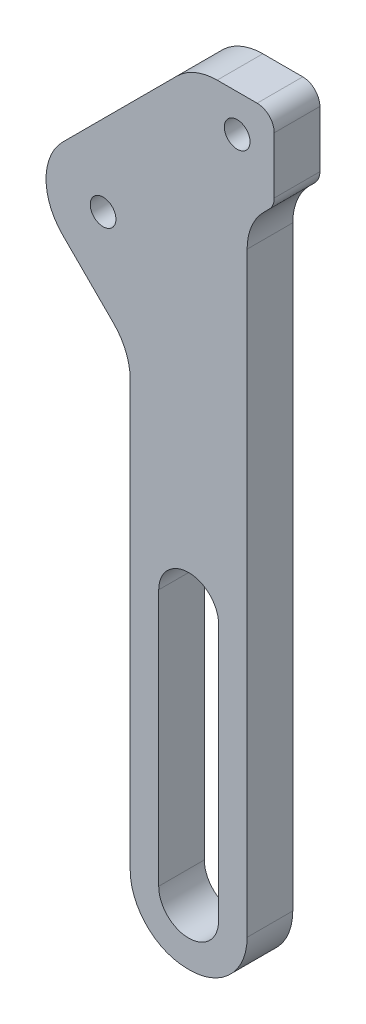
ISO-10303-21;
HEADER;
FILE_DESCRIPTION(('STEP AP214'),'2;1');
FILE_NAME('part.step','',(''),(''),'','','');
FILE_SCHEMA(('AUTOMOTIVE_DESIGN { 1 0 10303 214 1 1 1 1 }'));
ENDSEC;
DATA;
#1=APPLICATION_CONTEXT('core data for automotive mechanical design processes');
#2=APPLICATION_PROTOCOL_DEFINITION('international standard','automotive_design',2000,#1);
#3=PRODUCT_CONTEXT('',#1,'mechanical');
#4=PRODUCT('Part','Part','',(#3));
#5=PRODUCT_RELATED_PRODUCT_CATEGORY('part','',(#4));
#6=PRODUCT_DEFINITION_FORMATION('','',#4);
#7=PRODUCT_DEFINITION_CONTEXT('part definition',#1,'design');
#8=PRODUCT_DEFINITION('design','',#6,#7);
#9=PRODUCT_DEFINITION_SHAPE('','',#8);
#10=(LENGTH_UNIT() NAMED_UNIT(*) SI_UNIT(.MILLI.,.METRE.));
#11=(NAMED_UNIT(*) PLANE_ANGLE_UNIT() SI_UNIT($,.RADIAN.));
#12=(NAMED_UNIT(*) SI_UNIT($,.STERADIAN.) SOLID_ANGLE_UNIT());
#13=UNCERTAINTY_MEASURE_WITH_UNIT(LENGTH_MEASURE(1.E-05),#10,'distance_accuracy_value','');
#14=(GEOMETRIC_REPRESENTATION_CONTEXT(3) GLOBAL_UNCERTAINTY_ASSIGNED_CONTEXT((#13)) GLOBAL_UNIT_ASSIGNED_CONTEXT((#10,
#11,#12)) REPRESENTATION_CONTEXT('',''));
#15=CARTESIAN_POINT('',(0.,0.,0.));
#16=DIRECTION('',(0.,0.,1.));
#17=DIRECTION('',(1.,0.,0.));
#18=AXIS2_PLACEMENT_3D('',#15,#16,#17);
#19=CARTESIAN_POINT('',(0.,0.,0.));
#20=DIRECTION('',(0.,0.,1.));
#21=DIRECTION('',(1.,0.,0.));
#22=AXIS2_PLACEMENT_3D('',#19,#20,#21);
#23=PLANE('',#22);
#24=CARTESIAN_POINT('',(15.,-52.5,0.));
#25=DIRECTION('',(0.,0.,1.));
#26=DIRECTION('',(1.,0.,0.));
#27=AXIS2_PLACEMENT_3D('',#24,#25,#26);
#28=CIRCLE('',#27,5.25000000000001);
#29=CARTESIAN_POINT('',(20.25,-52.5,0.));
#30=VERTEX_POINT('',#29);
#31=CARTESIAN_POINT('',(9.75,-52.5,0.));
#32=VERTEX_POINT('',#31);
#33=EDGE_CURVE('E251',#30,#32,#28,.T.);
#34=ORIENTED_EDGE('',*,*,#33,.F.);
#35=DIRECTION('',(0.,1.,0.));
#36=VECTOR('',#35,1.);
#37=CARTESIAN_POINT('',(20.25,-52.5,0.));
#38=LINE('',#37,#36);
#39=CARTESIAN_POINT('',(20.25,-97.5,0.));
#40=VERTEX_POINT('',#39);
#41=EDGE_CURVE('E256',#40,#30,#38,.T.);
#42=ORIENTED_EDGE('',*,*,#41,.F.);
#43=CARTESIAN_POINT('',(15.,-97.5,0.));
#44=DIRECTION('',(0.,0.,1.));
#45=DIRECTION('',(1.,0.,0.));
#46=AXIS2_PLACEMENT_3D('',#43,#44,#45);
#47=CIRCLE('',#46,5.25000000000001);
#48=CARTESIAN_POINT('',(9.75000000000001,-97.5,0.));
#49=VERTEX_POINT('',#48);
#50=EDGE_CURVE('E270',#49,#40,#47,.T.);
#51=ORIENTED_EDGE('',*,*,#50,.F.);
#52=DIRECTION('',(0.,-1.,0.));
#53=VECTOR('',#52,1.);
#54=CARTESIAN_POINT('',(9.75,-52.5,0.));
#55=LINE('',#54,#53);
#56=EDGE_CURVE('E267',#32,#49,#55,.T.);
#57=ORIENTED_EDGE('',*,*,#56,.F.);
#58=EDGE_LOOP('',(#34,#42,#51,#57));
#59=FACE_BOUND('',#58,.T.);
#60=CARTESIAN_POINT('',(23.51,23.51,0.));
#61=DIRECTION('',(0.,0.,-1.));
#62=DIRECTION('',(-1.,0.,0.));
#63=AXIS2_PLACEMENT_3D('',#60,#61,#62);
#64=CIRCLE('',#63,2.25);
#65=CARTESIAN_POINT('',(21.26,23.51,0.));
#66=VERTEX_POINT('',#65);
#67=EDGE_CURVE('E248',#66,#66,#64,.T.);
#68=ORIENTED_EDGE('',*,*,#67,.T.);
#69=EDGE_LOOP('',(#68));
#70=FACE_BOUND('',#69,.T.);
#71=CARTESIAN_POINT('',(0.,0.,0.));
#72=DIRECTION('',(0.,0.,-1.));
#73=DIRECTION('',(-1.,0.,0.));
#74=AXIS2_PLACEMENT_3D('',#71,#72,#73);
#75=CIRCLE('',#74,2.25);
#76=CARTESIAN_POINT('',(-2.25,0.,0.));
#77=VERTEX_POINT('',#76);
#78=EDGE_CURVE('E236',#77,#77,#75,.T.);
#79=ORIENTED_EDGE('',*,*,#78,.T.);
#80=EDGE_LOOP('',(#79));
#81=FACE_BOUND('',#80,.T.);
#82=DIRECTION('',(0.707106781186549,0.707106781186546,0.));
#83=VECTOR('',#82,1.);
#84=CARTESIAN_POINT('',(7.07106781186542,-7.07106781186545,0.));
#85=LINE('',#84,#83);
#86=CARTESIAN_POINT('',(28.1789321881346,14.0367965644036,0.));
#87=VERTEX_POINT('',#86);
#88=CARTESIAN_POINT('',(29.1213203435596,14.9791847198287,0.));
#89=VERTEX_POINT('',#88);
#90=EDGE_CURVE('E211',#87,#89,#85,.T.);
#91=ORIENTED_EDGE('',*,*,#90,.T.);
#92=CARTESIAN_POINT('',(27.,17.1005050633883,0.));
#93=DIRECTION('',(0.,0.,1.));
#94=DIRECTION('',(1.,0.,0.));
#95=AXIS2_PLACEMENT_3D('',#92,#93,#94);
#96=CIRCLE('',#95,3.);
#97=CARTESIAN_POINT('',(30.,17.1005050633883,0.));
#98=VERTEX_POINT('',#97);
#99=EDGE_CURVE('E347',#89,#98,#96,.T.);
#100=ORIENTED_EDGE('',*,*,#99,.T.);
#101=DIRECTION('',(0.,1.,0.));
#102=VECTOR('',#101,1.);
#103=CARTESIAN_POINT('',(30.,30.,0.));
#104=LINE('',#103,#102);
#105=CARTESIAN_POINT('',(30.,27.,0.));
#106=VERTEX_POINT('',#105);
#107=EDGE_CURVE('E295',#98,#106,#104,.T.);
#108=ORIENTED_EDGE('',*,*,#107,.T.);
#109=CARTESIAN_POINT('',(27.,27.,0.));
#110=DIRECTION('',(0.,0.,1.));
#111=DIRECTION('',(1.,0.,0.));
#112=AXIS2_PLACEMENT_3D('',#109,#110,#111);
#113=CIRCLE('',#112,3.);
#114=CARTESIAN_POINT('',(27.,30.,0.));
#115=VERTEX_POINT('',#114);
#116=EDGE_CURVE('E345',#106,#115,#113,.T.);
#117=ORIENTED_EDGE('',*,*,#116,.T.);
#118=DIRECTION('',(-1.,0.,0.));
#119=VECTOR('',#118,1.);
#120=CARTESIAN_POINT('',(-10.,30.,0.));
#121=LINE('',#120,#119);
#122=CARTESIAN_POINT('',(20.,30.,0.));
#123=VERTEX_POINT('',#122);
#124=EDGE_CURVE('E288',#115,#123,#121,.T.);
#125=ORIENTED_EDGE('',*,*,#124,.T.);
#126=CARTESIAN_POINT('',(20.,20.,0.));
#127=DIRECTION('',(0.,0.,1.));
#128=DIRECTION('',(1.,0.,0.));
#129=AXIS2_PLACEMENT_3D('',#126,#127,#128);
#130=CIRCLE('',#129,10.);
#131=CARTESIAN_POINT('',(12.9289321881345,27.0710678118655,0.));
#132=VERTEX_POINT('',#131);
#133=EDGE_CURVE('E305',#123,#132,#130,.T.);
#134=ORIENTED_EDGE('',*,*,#133,.T.);
#135=DIRECTION('',(0.707106781186548,0.707106781186547,0.));
#136=VECTOR('',#135,1.);
#137=CARTESIAN_POINT('',(-7.07106781186547,7.07106781186548,0.));
#138=LINE('',#137,#136);
#139=CARTESIAN_POINT('',(-7.07106781186547,7.07106781186548,0.));
#140=VERTEX_POINT('',#139);
#141=EDGE_CURVE('E200',#140,#132,#138,.T.);
#142=ORIENTED_EDGE('',*,*,#141,.F.);
#143=CARTESIAN_POINT('',(0.,0.,0.));
#144=DIRECTION('',(0.,0.,1.));
#145=DIRECTION('',(1.,0.,0.));
#146=AXIS2_PLACEMENT_3D('',#143,#144,#145);
#147=CIRCLE('',#146,10.);
#148=CARTESIAN_POINT('',(-7.07106781186551,-7.07106781186544,0.));
#149=VERTEX_POINT('',#148);
#150=EDGE_CURVE('E192',#140,#149,#147,.T.);
#151=ORIENTED_EDGE('',*,*,#150,.T.);
#152=DIRECTION('',(0.707106781186544,-0.707106781186551,0.));
#153=VECTOR('',#152,1.);
#154=CARTESIAN_POINT('',(-7.07106781186551,-7.07106781186544,0.));
#155=LINE('',#154,#153);
#156=CARTESIAN_POINT('',(1.82106781186551,-15.9632034355966,0.));
#157=VERTEX_POINT('',#156);
#158=EDGE_CURVE('E186',#149,#157,#155,.T.);
#159=ORIENTED_EDGE('',*,*,#158,.T.);
#160=CARTESIAN_POINT('',(-5.25,-23.034271247462,0.));
#161=DIRECTION('',(0.,0.,1.));
#162=DIRECTION('',(1.,0.,0.));
#163=AXIS2_PLACEMENT_3D('',#160,#161,#162);
#164=CIRCLE('',#163,10.);
#165=CARTESIAN_POINT('',(4.75,-23.034271247462,0.));
#166=VERTEX_POINT('',#165);
#167=EDGE_CURVE('E338',#157,#166,#164,.F.);
#168=ORIENTED_EDGE('',*,*,#167,.T.);
#169=DIRECTION('',(0.,1.,0.));
#170=VECTOR('',#169,1.);
#171=CARTESIAN_POINT('',(4.75,0.,0.));
#172=LINE('',#171,#170);
#173=CARTESIAN_POINT('',(4.75,-97.5,0.));
#174=VERTEX_POINT('',#173);
#175=EDGE_CURVE('E221',#174,#166,#172,.T.);
#176=ORIENTED_EDGE('',*,*,#175,.F.);
#177=CARTESIAN_POINT('',(14.75,-97.5,0.));
#178=DIRECTION('',(0.,0.,1.));
#179=DIRECTION('',(1.,0.,0.));
#180=AXIS2_PLACEMENT_3D('',#177,#178,#179);
#181=CIRCLE('',#180,10.);
#182=CARTESIAN_POINT('',(14.75,-107.5,0.));
#183=VERTEX_POINT('',#182);
#184=EDGE_CURVE('E301',#174,#183,#181,.T.);
#185=ORIENTED_EDGE('',*,*,#184,.T.);
#186=DIRECTION('',(1.,0.,0.));
#187=VECTOR('',#186,1.);
#188=CARTESIAN_POINT('',(-9.99999999999999,-107.5,0.));
#189=LINE('',#188,#187);
#190=CARTESIAN_POINT('',(15.25,-107.5,0.));
#191=VERTEX_POINT('',#190);
#192=EDGE_CURVE('E277',#183,#191,#189,.T.);
#193=ORIENTED_EDGE('',*,*,#192,.T.);
#194=CARTESIAN_POINT('',(15.25,-97.5,0.));
#195=DIRECTION('',(0.,0.,1.));
#196=DIRECTION('',(1.,0.,0.));
#197=AXIS2_PLACEMENT_3D('',#194,#195,#196);
#198=CIRCLE('',#197,10.);
#199=CARTESIAN_POINT('',(25.25,-97.5,0.));
#200=VERTEX_POINT('',#199);
#201=EDGE_CURVE('E303',#191,#200,#198,.T.);
#202=ORIENTED_EDGE('',*,*,#201,.T.);
#203=DIRECTION('',(0.,1.,0.));
#204=VECTOR('',#203,1.);
#205=CARTESIAN_POINT('',(25.25,0.,0.));
#206=LINE('',#205,#204);
#207=CARTESIAN_POINT('',(25.25,6.96572875253813,0.));
#208=VERTEX_POINT('',#207);
#209=EDGE_CURVE('E208',#200,#208,#206,.T.);
#210=ORIENTED_EDGE('',*,*,#209,.T.);
#211=CARTESIAN_POINT('',(35.25,6.96572875253813,0.));
#212=DIRECTION('',(0.,0.,1.));
#213=DIRECTION('',(1.,0.,0.));
#214=AXIS2_PLACEMENT_3D('',#211,#212,#213);
#215=CIRCLE('',#214,10.);
#216=EDGE_CURVE('E334',#208,#87,#215,.F.);
#217=ORIENTED_EDGE('',*,*,#216,.T.);
#218=EDGE_LOOP('',(#91,#100,#108,#117,#125,#134,#142,#151,#159,#168,#176,#185,#193,#202,#210,#217));
#219=FACE_BOUND('',#218,.T.);
#220=ADVANCED_FACE('F37',(#59,#70,#81,#219),#23,.T.);
#221=CARTESIAN_POINT('',(0.,0.,-8.));
#222=DIRECTION('',(0.,0.,1.));
#223=DIRECTION('',(1.,0.,0.));
#224=AXIS2_PLACEMENT_3D('',#221,#222,#223);
#225=PLANE('',#224);
#226=DIRECTION('',(0.,1.,0.));
#227=VECTOR('',#226,1.);
#228=CARTESIAN_POINT('',(20.25,-52.5,-8.));
#229=LINE('',#228,#227);
#230=CARTESIAN_POINT('',(20.25,-97.5,-8.));
#231=VERTEX_POINT('',#230);
#232=CARTESIAN_POINT('',(20.25,-52.5,-8.));
#233=VERTEX_POINT('',#232);
#234=EDGE_CURVE('E262',#231,#233,#229,.T.);
#235=ORIENTED_EDGE('',*,*,#234,.T.);
#236=CARTESIAN_POINT('',(15.,-52.5,-8.));
#237=DIRECTION('',(0.,0.,1.));
#238=DIRECTION('',(1.,0.,0.));
#239=AXIS2_PLACEMENT_3D('',#236,#237,#238);
#240=CIRCLE('',#239,5.25000000000001);
#241=CARTESIAN_POINT('',(9.75,-52.5,-8.));
#242=VERTEX_POINT('',#241);
#243=EDGE_CURVE('E252',#233,#242,#240,.T.);
#244=ORIENTED_EDGE('',*,*,#243,.T.);
#245=DIRECTION('',(0.,-1.,0.));
#246=VECTOR('',#245,1.);
#247=CARTESIAN_POINT('',(9.75,-52.5,-8.));
#248=LINE('',#247,#246);
#249=CARTESIAN_POINT('',(9.75000000000001,-97.5,-8.));
#250=VERTEX_POINT('',#249);
#251=EDGE_CURVE('E255',#242,#250,#248,.T.);
#252=ORIENTED_EDGE('',*,*,#251,.T.);
#253=CARTESIAN_POINT('',(15.,-97.5,-8.));
#254=DIRECTION('',(0.,0.,1.));
#255=DIRECTION('',(1.,0.,0.));
#256=AXIS2_PLACEMENT_3D('',#253,#254,#255);
#257=CIRCLE('',#256,5.25000000000001);
#258=EDGE_CURVE('E259',#250,#231,#257,.T.);
#259=ORIENTED_EDGE('',*,*,#258,.T.);
#260=EDGE_LOOP('',(#235,#244,#252,#259));
#261=FACE_BOUND('',#260,.T.);
#262=CARTESIAN_POINT('',(23.51,23.51,-8.));
#263=DIRECTION('',(0.,0.,-1.));
#264=DIRECTION('',(-1.,0.,0.));
#265=AXIS2_PLACEMENT_3D('',#262,#263,#264);
#266=CIRCLE('',#265,4.);
#267=CARTESIAN_POINT('',(19.51,23.51,-8.));
#268=VERTEX_POINT('',#267);
#269=EDGE_CURVE('E239',#268,#268,#266,.T.);
#270=ORIENTED_EDGE('',*,*,#269,.F.);
#271=EDGE_LOOP('',(#270));
#272=FACE_BOUND('',#271,.T.);
#273=CARTESIAN_POINT('',(0.,0.,-8.));
#274=DIRECTION('',(0.,0.,-1.));
#275=DIRECTION('',(-1.,0.,0.));
#276=AXIS2_PLACEMENT_3D('',#273,#274,#275);
#277=CIRCLE('',#276,4.);
#278=CARTESIAN_POINT('',(-4.,0.,-8.));
#279=VERTEX_POINT('',#278);
#280=EDGE_CURVE('E227',#279,#279,#277,.T.);
#281=ORIENTED_EDGE('',*,*,#280,.F.);
#282=EDGE_LOOP('',(#281));
#283=FACE_BOUND('',#282,.T.);
#284=DIRECTION('',(0.,1.,0.));
#285=VECTOR('',#284,1.);
#286=CARTESIAN_POINT('',(30.,30.,-8.));
#287=LINE('',#286,#285);
#288=CARTESIAN_POINT('',(30.,17.1005050633883,-8.));
#289=VERTEX_POINT('',#288);
#290=CARTESIAN_POINT('',(30.,27.,-8.));
#291=VERTEX_POINT('',#290);
#292=EDGE_CURVE('E287',#289,#291,#287,.T.);
#293=ORIENTED_EDGE('',*,*,#292,.F.);
#294=CARTESIAN_POINT('',(27.,17.1005050633883,-8.));
#295=DIRECTION('',(0.,0.,1.));
#296=DIRECTION('',(1.,0.,0.));
#297=AXIS2_PLACEMENT_3D('',#294,#295,#296);
#298=CIRCLE('',#297,3.);
#299=CARTESIAN_POINT('',(29.1213203435596,14.9791847198287,-8.));
#300=VERTEX_POINT('',#299);
#301=EDGE_CURVE('E45',#289,#300,#298,.F.);
#302=ORIENTED_EDGE('',*,*,#301,.T.);
#303=DIRECTION('',(0.707106781186549,0.707106781186546,0.));
#304=VECTOR('',#303,1.);
#305=CARTESIAN_POINT('',(7.07106781186542,-7.07106781186545,-8.));
#306=LINE('',#305,#304);
#307=CARTESIAN_POINT('',(28.1789321881346,14.0367965644036,-8.));
#308=VERTEX_POINT('',#307);
#309=EDGE_CURVE('E205',#308,#300,#306,.T.);
#310=ORIENTED_EDGE('',*,*,#309,.F.);
#311=CARTESIAN_POINT('',(35.25,6.96572875253813,-8.));
#312=DIRECTION('',(0.,0.,1.));
#313=DIRECTION('',(1.,0.,0.));
#314=AXIS2_PLACEMENT_3D('',#311,#312,#313);
#315=CIRCLE('',#314,10.);
#316=CARTESIAN_POINT('',(25.25,6.96572875253813,-8.));
#317=VERTEX_POINT('',#316);
#318=EDGE_CURVE('E336',#308,#317,#315,.T.);
#319=ORIENTED_EDGE('',*,*,#318,.T.);
#320=DIRECTION('',(0.,1.,0.));
#321=VECTOR('',#320,1.);
#322=CARTESIAN_POINT('',(25.25,0.,-8.));
#323=LINE('',#322,#321);
#324=CARTESIAN_POINT('',(25.25,-97.5,-8.));
#325=VERTEX_POINT('',#324);
#326=EDGE_CURVE('E202',#325,#317,#323,.T.);
#327=ORIENTED_EDGE('',*,*,#326,.F.);
#328=CARTESIAN_POINT('',(15.25,-97.5,-8.));
#329=DIRECTION('',(0.,0.,1.));
#330=DIRECTION('',(1.,0.,0.));
#331=AXIS2_PLACEMENT_3D('',#328,#329,#330);
#332=CIRCLE('',#331,10.);
#333=CARTESIAN_POINT('',(15.25,-107.5,-8.));
#334=VERTEX_POINT('',#333);
#335=EDGE_CURVE('E310',#325,#334,#332,.F.);
#336=ORIENTED_EDGE('',*,*,#335,.T.);
#337=DIRECTION('',(1.,0.,0.));
#338=VECTOR('',#337,1.);
#339=CARTESIAN_POINT('',(-9.99999999999999,-107.5,-8.));
#340=LINE('',#339,#338);
#341=CARTESIAN_POINT('',(14.75,-107.5,-8.));
#342=VERTEX_POINT('',#341);
#343=EDGE_CURVE('E284',#342,#334,#340,.T.);
#344=ORIENTED_EDGE('',*,*,#343,.F.);
#345=CARTESIAN_POINT('',(14.75,-97.5,-8.));
#346=DIRECTION('',(0.,0.,1.));
#347=DIRECTION('',(1.,0.,0.));
#348=AXIS2_PLACEMENT_3D('',#345,#346,#347);
#349=CIRCLE('',#348,10.);
#350=CARTESIAN_POINT('',(4.75,-97.5,-8.));
#351=VERTEX_POINT('',#350);
#352=EDGE_CURVE('E308',#342,#351,#349,.F.);
#353=ORIENTED_EDGE('',*,*,#352,.T.);
#354=DIRECTION('',(0.,1.,0.));
#355=VECTOR('',#354,1.);
#356=CARTESIAN_POINT('',(4.75,0.,-8.));
#357=LINE('',#356,#355);
#358=CARTESIAN_POINT('',(4.75,-23.034271247462,-8.));
#359=VERTEX_POINT('',#358);
#360=EDGE_CURVE('E185',#351,#359,#357,.T.);
#361=ORIENTED_EDGE('',*,*,#360,.T.);
#362=CARTESIAN_POINT('',(-5.25,-23.034271247462,-8.));
#363=DIRECTION('',(0.,0.,1.));
#364=DIRECTION('',(1.,0.,0.));
#365=AXIS2_PLACEMENT_3D('',#362,#363,#364);
#366=CIRCLE('',#365,10.);
#367=CARTESIAN_POINT('',(1.82106781186551,-15.9632034355966,-8.));
#368=VERTEX_POINT('',#367);
#369=EDGE_CURVE('E340',#359,#368,#366,.T.);
#370=ORIENTED_EDGE('',*,*,#369,.T.);
#371=DIRECTION('',(0.707106781186544,-0.707106781186551,0.));
#372=VECTOR('',#371,1.);
#373=CARTESIAN_POINT('',(-7.07106781186551,-7.07106781186544,-8.));
#374=LINE('',#373,#372);
#375=CARTESIAN_POINT('',(-7.07106781186551,-7.07106781186544,-8.));
#376=VERTEX_POINT('',#375);
#377=EDGE_CURVE('E181',#376,#368,#374,.T.);
#378=ORIENTED_EDGE('',*,*,#377,.F.);
#379=CARTESIAN_POINT('',(0.,0.,-8.));
#380=DIRECTION('',(0.,0.,1.));
#381=DIRECTION('',(1.,0.,0.));
#382=AXIS2_PLACEMENT_3D('',#379,#380,#381);
#383=CIRCLE('',#382,10.);
#384=CARTESIAN_POINT('',(-7.07106781186547,7.07106781186548,-8.));
#385=VERTEX_POINT('',#384);
#386=EDGE_CURVE('E173',#385,#376,#383,.T.);
#387=ORIENTED_EDGE('',*,*,#386,.F.);
#388=DIRECTION('',(0.707106781186548,0.707106781186547,0.));
#389=VECTOR('',#388,1.);
#390=CARTESIAN_POINT('',(-7.07106781186547,7.07106781186548,-8.));
#391=LINE('',#390,#389);
#392=CARTESIAN_POINT('',(12.9289321881345,27.0710678118655,-8.));
#393=VERTEX_POINT('',#392);
#394=EDGE_CURVE('E178',#385,#393,#391,.T.);
#395=ORIENTED_EDGE('',*,*,#394,.T.);
#396=CARTESIAN_POINT('',(20.,20.,-8.));
#397=DIRECTION('',(0.,0.,1.));
#398=DIRECTION('',(1.,0.,0.));
#399=AXIS2_PLACEMENT_3D('',#396,#397,#398);
#400=CIRCLE('',#399,10.);
#401=CARTESIAN_POINT('',(20.,30.,-8.));
#402=VERTEX_POINT('',#401);
#403=EDGE_CURVE('E312',#393,#402,#400,.F.);
#404=ORIENTED_EDGE('',*,*,#403,.T.);
#405=DIRECTION('',(-1.,0.,0.));
#406=VECTOR('',#405,1.);
#407=CARTESIAN_POINT('',(-10.,30.,-8.));
#408=LINE('',#407,#406);
#409=CARTESIAN_POINT('',(27.,30.,-8.));
#410=VERTEX_POINT('',#409);
#411=EDGE_CURVE('E290',#410,#402,#408,.T.);
#412=ORIENTED_EDGE('',*,*,#411,.F.);
#413=CARTESIAN_POINT('',(27.,27.,-8.));
#414=DIRECTION('',(0.,0.,1.));
#415=DIRECTION('',(1.,0.,0.));
#416=AXIS2_PLACEMENT_3D('',#413,#414,#415);
#417=CIRCLE('',#416,3.);
#418=EDGE_CURVE('E57',#410,#291,#417,.F.);
#419=ORIENTED_EDGE('',*,*,#418,.T.);
#420=EDGE_LOOP('',(#293,#302,#310,#319,#327,#336,#344,#353,#361,#370,#378,#387,#395,#404,#412,#419));
#421=FACE_BOUND('',#420,.T.);
#422=ADVANCED_FACE('F175',(#261,#272,#283,#421),#225,.F.);
#423=CARTESIAN_POINT('',(30.,30.,-8.));
#424=DIRECTION('',(1.,0.,0.));
#425=DIRECTION('',(0.,1.,0.));
#426=AXIS2_PLACEMENT_3D('',#423,#424,#425);
#427=PLANE('',#426);
#428=ORIENTED_EDGE('',*,*,#107,.F.);
#429=DIRECTION('',(0.,0.,1.));
#430=VECTOR('',#429,1.);
#431=CARTESIAN_POINT('',(30.,17.1005050633883,-8.));
#432=LINE('',#431,#430);
#433=EDGE_CURVE('E352',#98,#289,#432,.F.);
#434=ORIENTED_EDGE('',*,*,#433,.T.);
#435=ORIENTED_EDGE('',*,*,#292,.T.);
#436=DIRECTION('',(0.,0.,1.));
#437=VECTOR('',#436,1.);
#438=CARTESIAN_POINT('',(30.,27.,-8.));
#439=LINE('',#438,#437);
#440=EDGE_CURVE('E349',#291,#106,#439,.T.);
#441=ORIENTED_EDGE('',*,*,#440,.T.);
#442=EDGE_LOOP('',(#428,#434,#435,#441));
#443=FACE_BOUND('',#442,.T.);
#444=ADVANCED_FACE('F368',(#443),#427,.T.);
#445=CARTESIAN_POINT('',(-9.99999999999999,-107.5,-8.));
#446=DIRECTION('',(0.,-1.,0.));
#447=DIRECTION('',(1.,0.,0.));
#448=AXIS2_PLACEMENT_3D('',#445,#446,#447);
#449=PLANE('',#448);
#450=ORIENTED_EDGE('',*,*,#343,.T.);
#451=DIRECTION('',(0.,0.,1.));
#452=VECTOR('',#451,1.);
#453=CARTESIAN_POINT('',(15.25,-107.5,-8.));
#454=LINE('',#453,#452);
#455=EDGE_CURVE('E331',#334,#191,#454,.T.);
#456=ORIENTED_EDGE('',*,*,#455,.T.);
#457=ORIENTED_EDGE('',*,*,#192,.F.);
#458=DIRECTION('',(0.,0.,1.));
#459=VECTOR('',#458,1.);
#460=CARTESIAN_POINT('',(14.75,-107.5,-8.));
#461=LINE('',#460,#459);
#462=EDGE_CURVE('E329',#183,#342,#461,.F.);
#463=ORIENTED_EDGE('',*,*,#462,.T.);
#464=EDGE_LOOP('',(#450,#456,#457,#463));
#465=FACE_BOUND('',#464,.T.);
#466=ADVANCED_FACE('F395',(#465),#449,.T.);
#467=CARTESIAN_POINT('',(-10.,30.,-8.));
#468=DIRECTION('',(0.,1.,0.));
#469=DIRECTION('',(0.,0.,1.));
#470=AXIS2_PLACEMENT_3D('',#467,#468,#469);
#471=PLANE('',#470);
#472=ORIENTED_EDGE('',*,*,#124,.F.);
#473=DIRECTION('',(0.,0.,1.));
#474=VECTOR('',#473,1.);
#475=CARTESIAN_POINT('',(27.,30.,-8.));
#476=LINE('',#475,#474);
#477=EDGE_CURVE('E11',#115,#410,#476,.F.);
#478=ORIENTED_EDGE('',*,*,#477,.T.);
#479=ORIENTED_EDGE('',*,*,#411,.T.);
#480=DIRECTION('',(0.,0.,1.));
#481=VECTOR('',#480,1.);
#482=CARTESIAN_POINT('',(20.,30.,0.));
#483=LINE('',#482,#481);
#484=EDGE_CURVE('E292',#402,#123,#483,.T.);
#485=ORIENTED_EDGE('',*,*,#484,.T.);
#486=EDGE_LOOP('',(#472,#478,#479,#485));
#487=FACE_BOUND('',#486,.T.);
#488=ADVANCED_FACE('F372',(#487),#471,.T.);
#489=CARTESIAN_POINT('',(15.,-52.5,-8.));
#490=DIRECTION('',(0.,0.,1.));
#491=DIRECTION('',(1.,0.,0.));
#492=AXIS2_PLACEMENT_3D('',#489,#490,#491);
#493=CYLINDRICAL_SURFACE('',#492,5.25000000000001);
#494=ORIENTED_EDGE('',*,*,#33,.T.);
#495=DIRECTION('',(0.,0.,1.));
#496=VECTOR('',#495,1.);
#497=CARTESIAN_POINT('',(9.75,-52.5,-8.));
#498=LINE('',#497,#496);
#499=EDGE_CURVE('E265',#242,#32,#498,.T.);
#500=ORIENTED_EDGE('',*,*,#499,.F.);
#501=ORIENTED_EDGE('',*,*,#243,.F.);
#502=DIRECTION('',(0.,0.,1.));
#503=VECTOR('',#502,1.);
#504=CARTESIAN_POINT('',(20.25,-52.5,-8.));
#505=LINE('',#504,#503);
#506=EDGE_CURVE('E275',#233,#30,#505,.T.);
#507=ORIENTED_EDGE('',*,*,#506,.T.);
#508=EDGE_LOOP('',(#494,#500,#501,#507));
#509=FACE_BOUND('',#508,.T.);
#510=ADVANCED_FACE('F431',(#509),#493,.F.);
#511=CARTESIAN_POINT('',(20.25,-52.5,-8.));
#512=DIRECTION('',(1.,0.,0.));
#513=DIRECTION('',(0.,1.,0.));
#514=AXIS2_PLACEMENT_3D('',#511,#512,#513);
#515=PLANE('',#514);
#516=ORIENTED_EDGE('',*,*,#41,.T.);
#517=ORIENTED_EDGE('',*,*,#506,.F.);
#518=ORIENTED_EDGE('',*,*,#234,.F.);
#519=DIRECTION('',(0.,0.,1.));
#520=VECTOR('',#519,1.);
#521=CARTESIAN_POINT('',(20.25,-97.5,-8.));
#522=LINE('',#521,#520);
#523=EDGE_CURVE('E278',#231,#40,#522,.T.);
#524=ORIENTED_EDGE('',*,*,#523,.T.);
#525=EDGE_LOOP('',(#516,#517,#518,#524));
#526=FACE_BOUND('',#525,.T.);
#527=ADVANCED_FACE('F593',(#526),#515,.F.);
#528=CARTESIAN_POINT('',(15.,-97.5,-8.));
#529=DIRECTION('',(0.,0.,1.));
#530=DIRECTION('',(1.,0.,0.));
#531=AXIS2_PLACEMENT_3D('',#528,#529,#530);
#532=CYLINDRICAL_SURFACE('',#531,5.25000000000001);
#533=ORIENTED_EDGE('',*,*,#50,.T.);
#534=ORIENTED_EDGE('',*,*,#523,.F.);
#535=ORIENTED_EDGE('',*,*,#258,.F.);
#536=DIRECTION('',(0.,0.,1.));
#537=VECTOR('',#536,1.);
#538=CARTESIAN_POINT('',(9.75000000000001,-97.5,-8.));
#539=LINE('',#538,#537);
#540=EDGE_CURVE('E280',#250,#49,#539,.T.);
#541=ORIENTED_EDGE('',*,*,#540,.T.);
#542=EDGE_LOOP('',(#533,#534,#535,#541));
#543=FACE_BOUND('',#542,.T.);
#544=ADVANCED_FACE('F599',(#543),#532,.F.);
#545=CARTESIAN_POINT('',(9.75,-52.5,-8.));
#546=DIRECTION('',(-1.,0.,0.));
#547=DIRECTION('',(0.,-1.,0.));
#548=AXIS2_PLACEMENT_3D('',#545,#546,#547);
#549=PLANE('',#548);
#550=ORIENTED_EDGE('',*,*,#56,.T.);
#551=ORIENTED_EDGE('',*,*,#540,.F.);
#552=ORIENTED_EDGE('',*,*,#251,.F.);
#553=ORIENTED_EDGE('',*,*,#499,.T.);
#554=EDGE_LOOP('',(#550,#551,#552,#553));
#555=FACE_BOUND('',#554,.T.);
#556=ADVANCED_FACE('F607',(#555),#549,.F.);
#557=CARTESIAN_POINT('',(23.51,23.51,-8.));
#558=DIRECTION('',(0.,0.,-1.));
#559=DIRECTION('',(-1.,0.,0.));
#560=AXIS2_PLACEMENT_3D('',#557,#558,#559);
#561=CYLINDRICAL_SURFACE('',#560,2.25);
#562=ORIENTED_EDGE('',*,*,#67,.F.);
#563=EDGE_LOOP('',(#562));
#564=FACE_BOUND('',#563,.T.);
#565=CARTESIAN_POINT('',(23.51,23.51,-4.));
#566=DIRECTION('',(0.,0.,-1.));
#567=DIRECTION('',(-1.,0.,0.));
#568=AXIS2_PLACEMENT_3D('',#565,#566,#567);
#569=CIRCLE('',#568,2.25);
#570=CARTESIAN_POINT('',(21.26,23.51,-4.));
#571=VERTEX_POINT('',#570);
#572=EDGE_CURVE('E245',#571,#571,#569,.T.);
#573=ORIENTED_EDGE('',*,*,#572,.T.);
#574=EDGE_LOOP('',(#573));
#575=FACE_BOUND('',#574,.T.);
#576=ADVANCED_FACE('F615',(#564,#575),#561,.F.);
#577=CARTESIAN_POINT('',(25.76,23.51,-4.));
#578=DIRECTION('',(0.,0.,1.));
#579=DIRECTION('',(1.,0.,0.));
#580=AXIS2_PLACEMENT_3D('',#577,#578,#579);
#581=PLANE('',#580);
#582=ORIENTED_EDGE('',*,*,#572,.F.);
#583=EDGE_LOOP('',(#582));
#584=FACE_BOUND('',#583,.T.);
#585=CARTESIAN_POINT('',(23.51,23.51,-4.));
#586=DIRECTION('',(0.,0.,-1.));
#587=DIRECTION('',(-1.,0.,0.));
#588=AXIS2_PLACEMENT_3D('',#585,#586,#587);
#589=CIRCLE('',#588,4.);
#590=CARTESIAN_POINT('',(19.51,23.51,-4.));
#591=VERTEX_POINT('',#590);
#592=EDGE_CURVE('E242',#591,#591,#589,.T.);
#593=ORIENTED_EDGE('',*,*,#592,.T.);
#594=EDGE_LOOP('',(#593));
#595=FACE_BOUND('',#594,.T.);
#596=ADVANCED_FACE('F623',(#584,#595),#581,.F.);
#597=CARTESIAN_POINT('',(23.51,23.51,-8.));
#598=DIRECTION('',(0.,0.,-1.));
#599=DIRECTION('',(-1.,0.,0.));
#600=AXIS2_PLACEMENT_3D('',#597,#598,#599);
#601=CYLINDRICAL_SURFACE('',#600,4.);
#602=ORIENTED_EDGE('',*,*,#592,.F.);
#603=EDGE_LOOP('',(#602));
#604=FACE_BOUND('',#603,.T.);
#605=ORIENTED_EDGE('',*,*,#269,.T.);
#606=EDGE_LOOP('',(#605));
#607=FACE_BOUND('',#606,.T.);
#608=ADVANCED_FACE('F631',(#604,#607),#601,.F.);
#609=CARTESIAN_POINT('',(0.,0.,-8.));
#610=DIRECTION('',(0.,0.,-1.));
#611=DIRECTION('',(-1.,0.,0.));
#612=AXIS2_PLACEMENT_3D('',#609,#610,#611);
#613=CYLINDRICAL_SURFACE('',#612,2.25);
#614=ORIENTED_EDGE('',*,*,#78,.F.);
#615=EDGE_LOOP('',(#614));
#616=FACE_BOUND('',#615,.T.);
#617=CARTESIAN_POINT('',(0.,0.,-4.));
#618=DIRECTION('',(0.,0.,-1.));
#619=DIRECTION('',(-1.,0.,0.));
#620=AXIS2_PLACEMENT_3D('',#617,#618,#619);
#621=CIRCLE('',#620,2.25);
#622=CARTESIAN_POINT('',(-2.25,0.,-4.));
#623=VERTEX_POINT('',#622);
#624=EDGE_CURVE('E233',#623,#623,#621,.T.);
#625=ORIENTED_EDGE('',*,*,#624,.T.);
#626=EDGE_LOOP('',(#625));
#627=FACE_BOUND('',#626,.T.);
#628=ADVANCED_FACE('F639',(#616,#627),#613,.F.);
#629=CARTESIAN_POINT('',(2.25,0.,-4.));
#630=DIRECTION('',(0.,0.,1.));
#631=DIRECTION('',(1.,0.,0.));
#632=AXIS2_PLACEMENT_3D('',#629,#630,#631);
#633=PLANE('',#632);
#634=ORIENTED_EDGE('',*,*,#624,.F.);
#635=EDGE_LOOP('',(#634));
#636=FACE_BOUND('',#635,.T.);
#637=CARTESIAN_POINT('',(0.,0.,-4.));
#638=DIRECTION('',(0.,0.,-1.));
#639=DIRECTION('',(-1.,0.,0.));
#640=AXIS2_PLACEMENT_3D('',#637,#638,#639);
#641=CIRCLE('',#640,4.);
#642=CARTESIAN_POINT('',(-4.,0.,-4.));
#643=VERTEX_POINT('',#642);
#644=EDGE_CURVE('E230',#643,#643,#641,.T.);
#645=ORIENTED_EDGE('',*,*,#644,.T.);
#646=EDGE_LOOP('',(#645));
#647=FACE_BOUND('',#646,.T.);
#648=ADVANCED_FACE('F647',(#636,#647),#633,.F.);
#649=CARTESIAN_POINT('',(0.,0.,-8.));
#650=DIRECTION('',(0.,0.,-1.));
#651=DIRECTION('',(-1.,0.,0.));
#652=AXIS2_PLACEMENT_3D('',#649,#650,#651);
#653=CYLINDRICAL_SURFACE('',#652,4.);
#654=ORIENTED_EDGE('',*,*,#644,.F.);
#655=EDGE_LOOP('',(#654));
#656=FACE_BOUND('',#655,.T.);
#657=ORIENTED_EDGE('',*,*,#280,.T.);
#658=EDGE_LOOP('',(#657));
#659=FACE_BOUND('',#658,.T.);
#660=ADVANCED_FACE('F557',(#656,#659),#653,.F.);
#661=CARTESIAN_POINT('',(0.,0.,-8.));
#662=DIRECTION('',(0.,0.,1.));
#663=DIRECTION('',(1.,0.,0.));
#664=AXIS2_PLACEMENT_3D('',#661,#662,#663);
#665=CYLINDRICAL_SURFACE('',#664,10.);
#666=ORIENTED_EDGE('',*,*,#150,.F.);
#667=DIRECTION('',(0.,0.,1.));
#668=VECTOR('',#667,1.);
#669=CARTESIAN_POINT('',(-7.07106781186547,7.07106781186548,-8.));
#670=LINE('',#669,#668);
#671=EDGE_CURVE('E189',#385,#140,#670,.T.);
#672=ORIENTED_EDGE('',*,*,#671,.F.);
#673=ORIENTED_EDGE('',*,*,#386,.T.);
#674=DIRECTION('',(0.,0.,1.));
#675=VECTOR('',#674,1.);
#676=CARTESIAN_POINT('',(-7.07106781186551,-7.07106781186544,-8.));
#677=LINE('',#676,#675);
#678=EDGE_CURVE('E219',#376,#149,#677,.T.);
#679=ORIENTED_EDGE('',*,*,#678,.T.);
#680=EDGE_LOOP('',(#666,#672,#673,#679));
#681=FACE_BOUND('',#680,.T.);
#682=ADVANCED_FACE('F190',(#681),#665,.T.);
#683=CARTESIAN_POINT('',(-7.07106781186551,-7.07106781186544,-8.));
#684=DIRECTION('',(-0.707106781186551,-0.707106781186544,0.));
#685=DIRECTION('',(0.707106781186544,-0.707106781186551,0.));
#686=AXIS2_PLACEMENT_3D('',#683,#684,#685);
#687=PLANE('',#686);
#688=ORIENTED_EDGE('',*,*,#377,.T.);
#689=DIRECTION('',(0.,0.,1.));
#690=VECTOR('',#689,1.);
#691=CARTESIAN_POINT('',(1.82106781186551,-15.9632034355966,-8.));
#692=LINE('',#691,#690);
#693=EDGE_CURVE('E321',#368,#157,#692,.T.);
#694=ORIENTED_EDGE('',*,*,#693,.T.);
#695=ORIENTED_EDGE('',*,*,#158,.F.);
#696=ORIENTED_EDGE('',*,*,#678,.F.);
#697=EDGE_LOOP('',(#688,#694,#695,#696));
#698=FACE_BOUND('',#697,.T.);
#699=ADVANCED_FACE('F378',(#698),#687,.T.);
#700=CARTESIAN_POINT('',(4.75,0.,-8.));
#701=DIRECTION('',(1.,0.,0.));
#702=DIRECTION('',(0.,1.,0.));
#703=AXIS2_PLACEMENT_3D('',#700,#701,#702);
#704=PLANE('',#703);
#705=ORIENTED_EDGE('',*,*,#175,.T.);
#706=DIRECTION('',(0.,0.,1.));
#707=VECTOR('',#706,1.);
#708=CARTESIAN_POINT('',(4.75,-23.034271247462,-8.));
#709=LINE('',#708,#707);
#710=EDGE_CURVE('E327',#166,#359,#709,.F.);
#711=ORIENTED_EDGE('',*,*,#710,.T.);
#712=ORIENTED_EDGE('',*,*,#360,.F.);
#713=DIRECTION('',(0.,0.,1.));
#714=VECTOR('',#713,1.);
#715=CARTESIAN_POINT('',(4.75,-97.5,0.));
#716=LINE('',#715,#714);
#717=EDGE_CURVE('E324',#351,#174,#716,.T.);
#718=ORIENTED_EDGE('',*,*,#717,.T.);
#719=EDGE_LOOP('',(#705,#711,#712,#718));
#720=FACE_BOUND('',#719,.T.);
#721=ADVANCED_FACE('F386',(#720),#704,.F.);
#722=CARTESIAN_POINT('',(-7.07106781186547,7.07106781186548,-8.));
#723=DIRECTION('',(0.707106781186547,-0.707106781186548,0.));
#724=DIRECTION('',(0.707106781186548,0.707106781186547,0.));
#725=AXIS2_PLACEMENT_3D('',#722,#723,#724);
#726=PLANE('',#725);
#727=ORIENTED_EDGE('',*,*,#141,.T.);
#728=DIRECTION('',(0.,0.,1.));
#729=VECTOR('',#728,1.);
#730=CARTESIAN_POINT('',(12.9289321881345,27.0710678118655,-8.));
#731=LINE('',#730,#729);
#732=EDGE_CURVE('E199',#132,#393,#731,.F.);
#733=ORIENTED_EDGE('',*,*,#732,.T.);
#734=ORIENTED_EDGE('',*,*,#394,.F.);
#735=ORIENTED_EDGE('',*,*,#671,.T.);
#736=EDGE_LOOP('',(#727,#733,#734,#735));
#737=FACE_BOUND('',#736,.T.);
#738=ADVANCED_FACE('F197',(#737),#726,.F.);
#739=CARTESIAN_POINT('',(7.07106781186542,-7.07106781186545,-8.));
#740=DIRECTION('',(0.707106781186546,-0.707106781186549,0.));
#741=DIRECTION('',(0.707106781186549,0.707106781186546,0.));
#742=AXIS2_PLACEMENT_3D('',#739,#740,#741);
#743=PLANE('',#742);
#744=ORIENTED_EDGE('',*,*,#309,.T.);
#745=DIRECTION('',(0.,0.,1.));
#746=VECTOR('',#745,1.);
#747=CARTESIAN_POINT('',(29.1213203435596,14.9791847198287,-8.));
#748=LINE('',#747,#746);
#749=EDGE_CURVE('E342',#300,#89,#748,.T.);
#750=ORIENTED_EDGE('',*,*,#749,.T.);
#751=ORIENTED_EDGE('',*,*,#90,.F.);
#752=DIRECTION('',(0.,0.,1.));
#753=VECTOR('',#752,1.);
#754=CARTESIAN_POINT('',(28.1789321881346,14.0367965644036,-8.));
#755=LINE('',#754,#753);
#756=EDGE_CURVE('E319',#87,#308,#755,.F.);
#757=ORIENTED_EDGE('',*,*,#756,.T.);
#758=EDGE_LOOP('',(#744,#750,#751,#757));
#759=FACE_BOUND('',#758,.T.);
#760=ADVANCED_FACE('F361',(#759),#743,.T.);
#761=CARTESIAN_POINT('',(25.25,0.,-8.));
#762=DIRECTION('',(1.,0.,0.));
#763=DIRECTION('',(0.,0.,-1.));
#764=AXIS2_PLACEMENT_3D('',#761,#762,#763);
#765=PLANE('',#764);
#766=ORIENTED_EDGE('',*,*,#326,.T.);
#767=DIRECTION('',(0.,0.,1.));
#768=VECTOR('',#767,1.);
#769=CARTESIAN_POINT('',(25.25,6.96572875253813,0.));
#770=LINE('',#769,#768);
#771=EDGE_CURVE('E316',#317,#208,#770,.T.);
#772=ORIENTED_EDGE('',*,*,#771,.T.);
#773=ORIENTED_EDGE('',*,*,#209,.F.);
#774=DIRECTION('',(0.,0.,1.));
#775=VECTOR('',#774,1.);
#776=CARTESIAN_POINT('',(25.25,-97.5,-8.));
#777=LINE('',#776,#775);
#778=EDGE_CURVE('E314',#200,#325,#777,.F.);
#779=ORIENTED_EDGE('',*,*,#778,.T.);
#780=EDGE_LOOP('',(#766,#772,#773,#779));
#781=FACE_BOUND('',#780,.T.);
#782=ADVANCED_FACE('F403',(#781),#765,.T.);
#783=CARTESIAN_POINT('',(20.,20.,-8.));
#784=DIRECTION('',(0.,0.,-1.));
#785=DIRECTION('',(-1.,0.,0.));
#786=AXIS2_PLACEMENT_3D('',#783,#784,#785);
#787=CYLINDRICAL_SURFACE('',#786,10.);
#788=ORIENTED_EDGE('',*,*,#403,.F.);
#789=ORIENTED_EDGE('',*,*,#732,.F.);
#790=ORIENTED_EDGE('',*,*,#133,.F.);
#791=ORIENTED_EDGE('',*,*,#484,.F.);
#792=EDGE_LOOP('',(#788,#789,#790,#791));
#793=FACE_BOUND('',#792,.T.);
#794=ADVANCED_FACE('F375',(#793),#787,.T.);
#795=CARTESIAN_POINT('',(35.25,6.96572875253813,-8.));
#796=DIRECTION('',(0.,0.,-1.));
#797=DIRECTION('',(-1.,0.,0.));
#798=AXIS2_PLACEMENT_3D('',#795,#796,#797);
#799=CYLINDRICAL_SURFACE('',#798,10.);
#800=ORIENTED_EDGE('',*,*,#318,.F.);
#801=ORIENTED_EDGE('',*,*,#756,.F.);
#802=ORIENTED_EDGE('',*,*,#216,.F.);
#803=ORIENTED_EDGE('',*,*,#771,.F.);
#804=EDGE_LOOP('',(#800,#801,#802,#803));
#805=FACE_BOUND('',#804,.T.);
#806=ADVANCED_FACE('F407',(#805),#799,.F.);
#807=CARTESIAN_POINT('',(-5.25,-23.034271247462,-8.));
#808=DIRECTION('',(0.,0.,1.));
#809=DIRECTION('',(1.,0.,0.));
#810=AXIS2_PLACEMENT_3D('',#807,#808,#809);
#811=CYLINDRICAL_SURFACE('',#810,10.);
#812=ORIENTED_EDGE('',*,*,#369,.F.);
#813=ORIENTED_EDGE('',*,*,#710,.F.);
#814=ORIENTED_EDGE('',*,*,#167,.F.);
#815=ORIENTED_EDGE('',*,*,#693,.F.);
#816=EDGE_LOOP('',(#812,#813,#814,#815));
#817=FACE_BOUND('',#816,.T.);
#818=ADVANCED_FACE('F382',(#817),#811,.F.);
#819=CARTESIAN_POINT('',(15.25,-97.5,-8.));
#820=DIRECTION('',(0.,0.,1.));
#821=DIRECTION('',(1.,0.,0.));
#822=AXIS2_PLACEMENT_3D('',#819,#820,#821);
#823=CYLINDRICAL_SURFACE('',#822,10.);
#824=ORIENTED_EDGE('',*,*,#335,.F.);
#825=ORIENTED_EDGE('',*,*,#778,.F.);
#826=ORIENTED_EDGE('',*,*,#201,.F.);
#827=ORIENTED_EDGE('',*,*,#455,.F.);
#828=EDGE_LOOP('',(#824,#825,#826,#827));
#829=FACE_BOUND('',#828,.T.);
#830=ADVANCED_FACE('F399',(#829),#823,.T.);
#831=CARTESIAN_POINT('',(14.75,-97.5,-8.));
#832=DIRECTION('',(0.,0.,-1.));
#833=DIRECTION('',(-1.,0.,0.));
#834=AXIS2_PLACEMENT_3D('',#831,#832,#833);
#835=CYLINDRICAL_SURFACE('',#834,10.);
#836=ORIENTED_EDGE('',*,*,#352,.F.);
#837=ORIENTED_EDGE('',*,*,#462,.F.);
#838=ORIENTED_EDGE('',*,*,#184,.F.);
#839=ORIENTED_EDGE('',*,*,#717,.F.);
#840=EDGE_LOOP('',(#836,#837,#838,#839));
#841=FACE_BOUND('',#840,.T.);
#842=ADVANCED_FACE('F392',(#841),#835,.T.);
#843=CARTESIAN_POINT('',(27.,17.1005050633883,-8.));
#844=DIRECTION('',(0.,0.,1.));
#845=DIRECTION('',(1.,0.,0.));
#846=AXIS2_PLACEMENT_3D('',#843,#844,#845);
#847=CYLINDRICAL_SURFACE('',#846,3.);
#848=ORIENTED_EDGE('',*,*,#301,.F.);
#849=ORIENTED_EDGE('',*,*,#433,.F.);
#850=ORIENTED_EDGE('',*,*,#99,.F.);
#851=ORIENTED_EDGE('',*,*,#749,.F.);
#852=EDGE_LOOP('',(#848,#849,#850,#851));
#853=FACE_BOUND('',#852,.T.);
#854=ADVANCED_FACE('F364',(#853),#847,.T.);
#855=CARTESIAN_POINT('',(27.,27.,-8.));
#856=DIRECTION('',(0.,0.,1.));
#857=DIRECTION('',(1.,0.,0.));
#858=AXIS2_PLACEMENT_3D('',#855,#856,#857);
#859=CYLINDRICAL_SURFACE('',#858,3.);
#860=ORIENTED_EDGE('',*,*,#418,.F.);
#861=ORIENTED_EDGE('',*,*,#477,.F.);
#862=ORIENTED_EDGE('',*,*,#116,.F.);
#863=ORIENTED_EDGE('',*,*,#440,.F.);
#864=EDGE_LOOP('',(#860,#861,#862,#863));
#865=FACE_BOUND('',#864,.T.);
#866=ADVANCED_FACE('F39',(#865),#859,.T.);
#867=CLOSED_SHELL('',(#220,#422,#444,#466,#488,#510,#527,#544,#556,#576,#596,#608,#628,#648,
#660,#682,#699,#721,#738,#760,#782,#794,#806,#818,#830,#842,#854,#866));
#868=MANIFOLD_SOLID_BREP('B2',#867);
#869=ADVANCED_BREP_SHAPE_REPRESENTATION('',(#18,#868),#14);
#870=SHAPE_DEFINITION_REPRESENTATION(#9,#869);
ENDSEC;
END-ISO-10303-21;
